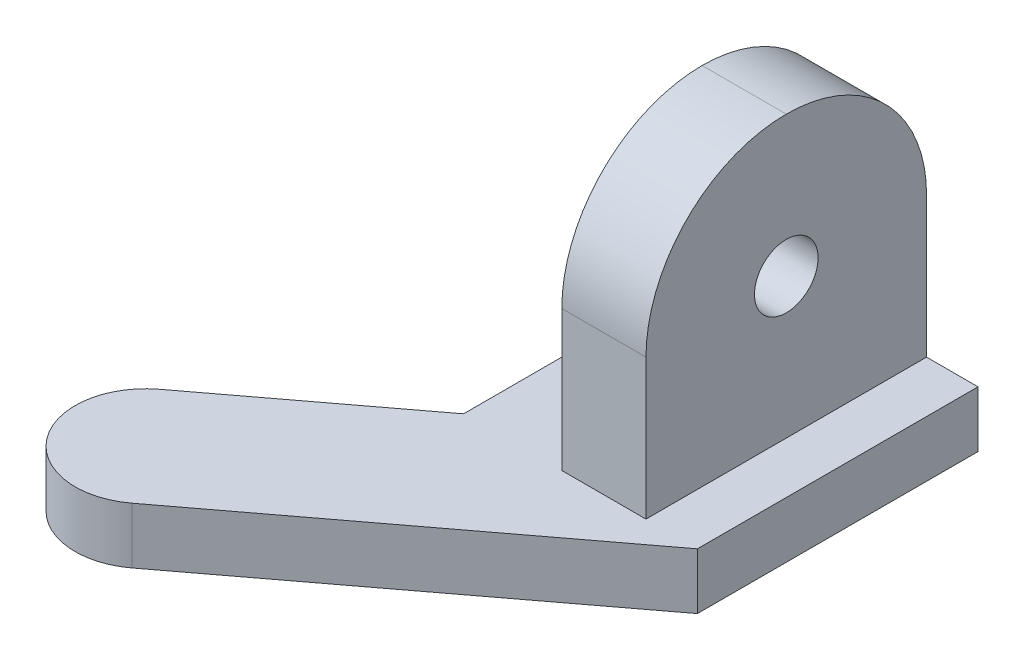
ISO-10303-21;
HEADER;
FILE_DESCRIPTION(('STEP AP214'),'2;1');
FILE_NAME('part.step','',(''),(''),'','','');
FILE_SCHEMA(('AUTOMOTIVE_DESIGN { 1 0 10303 214 1 1 1 1 }'));
ENDSEC;
DATA;
#1=APPLICATION_CONTEXT('core data for automotive mechanical design processes');
#2=APPLICATION_PROTOCOL_DEFINITION('international standard','automotive_design',2000,#1);
#3=PRODUCT_CONTEXT('',#1,'mechanical');
#4=PRODUCT('Part','Part','',(#3));
#5=PRODUCT_RELATED_PRODUCT_CATEGORY('part','',(#4));
#6=PRODUCT_DEFINITION_FORMATION('','',#4);
#7=PRODUCT_DEFINITION_CONTEXT('part definition',#1,'design');
#8=PRODUCT_DEFINITION('design','',#6,#7);
#9=PRODUCT_DEFINITION_SHAPE('','',#8);
#10=(LENGTH_UNIT() NAMED_UNIT(*) SI_UNIT(.MILLI.,.METRE.));
#11=(NAMED_UNIT(*) PLANE_ANGLE_UNIT() SI_UNIT($,.RADIAN.));
#12=(NAMED_UNIT(*) SI_UNIT($,.STERADIAN.) SOLID_ANGLE_UNIT());
#13=UNCERTAINTY_MEASURE_WITH_UNIT(LENGTH_MEASURE(1.E-05),#10,'distance_accuracy_value','');
#14=(GEOMETRIC_REPRESENTATION_CONTEXT(3) GLOBAL_UNCERTAINTY_ASSIGNED_CONTEXT((#13)) GLOBAL_UNIT_ASSIGNED_CONTEXT((#10,
#11,#12)) REPRESENTATION_CONTEXT('',''));
#15=CARTESIAN_POINT('',(0.,0.,0.));
#16=DIRECTION('',(0.,0.,1.));
#17=DIRECTION('',(1.,0.,0.));
#18=AXIS2_PLACEMENT_3D('',#15,#16,#17);
#19=CARTESIAN_POINT('',(6.25,3.,-7.5));
#20=DIRECTION('',(-1.,0.,0.));
#21=DIRECTION('',(0.,0.,1.));
#22=AXIS2_PLACEMENT_3D('',#19,#20,#21);
#23=PLANE('',#22);
#24=DIRECTION('',(0.,0.,-1.));
#25=VECTOR('',#24,1.);
#26=CARTESIAN_POINT('',(6.25,0.,-7.5));
#27=LINE('',#26,#25);
#28=CARTESIAN_POINT('',(6.25,0.,7.5));
#29=VERTEX_POINT('',#28);
#30=CARTESIAN_POINT('',(6.25,0.,-7.5));
#31=VERTEX_POINT('',#30);
#32=EDGE_CURVE('E195',#29,#31,#27,.T.);
#33=ORIENTED_EDGE('',*,*,#32,.T.);
#34=DIRECTION('',(0.,-1.,0.));
#35=VECTOR('',#34,1.);
#36=CARTESIAN_POINT('',(6.25,3.,-7.5));
#37=LINE('',#36,#35);
#38=CARTESIAN_POINT('',(6.25,3.,-7.5));
#39=VERTEX_POINT('',#38);
#40=EDGE_CURVE('E165',#39,#31,#37,.T.);
#41=ORIENTED_EDGE('',*,*,#40,.F.);
#42=DIRECTION('',(0.,0.,-1.));
#43=VECTOR('',#42,1.);
#44=CARTESIAN_POINT('',(6.25,3.,-7.5));
#45=LINE('',#44,#43);
#46=CARTESIAN_POINT('',(6.25,3.,7.5));
#47=VERTEX_POINT('',#46);
#48=EDGE_CURVE('E185',#47,#39,#45,.T.);
#49=ORIENTED_EDGE('',*,*,#48,.F.);
#50=DIRECTION('',(0.,-1.,0.));
#51=VECTOR('',#50,1.);
#52=CARTESIAN_POINT('',(6.25,3.,7.5));
#53=LINE('',#52,#51);
#54=EDGE_CURVE('E194',#47,#29,#53,.T.);
#55=ORIENTED_EDGE('',*,*,#54,.T.);
#56=EDGE_LOOP('',(#33,#41,#49,#55));
#57=FACE_BOUND('',#56,.T.);
#58=ADVANCED_FACE('F34',(#57),#23,.F.);
#59=CARTESIAN_POINT('',(-6.25,3.,-7.5));
#60=DIRECTION('',(0.,0.,1.));
#61=DIRECTION('',(1.,0.,0.));
#62=AXIS2_PLACEMENT_3D('',#59,#60,#61);
#63=PLANE('',#62);
#64=DIRECTION('',(0.,-1.,0.));
#65=VECTOR('',#64,1.);
#66=CARTESIAN_POINT('',(-1.,18.,-7.5));
#67=LINE('',#66,#65);
#68=CARTESIAN_POINT('',(-1.,10.5,-7.5));
#69=VERTEX_POINT('',#68);
#70=CARTESIAN_POINT('',(-0.999999999999999,3.,-7.5));
#71=VERTEX_POINT('',#70);
#72=EDGE_CURVE('E131',#69,#71,#67,.T.);
#73=ORIENTED_EDGE('',*,*,#72,.F.);
#74=DIRECTION('',(-1.,0.,0.));
#75=VECTOR('',#74,1.);
#76=CARTESIAN_POINT('',(3.5,10.5,-7.5));
#77=LINE('',#76,#75);
#78=CARTESIAN_POINT('',(3.5,10.5,-7.5));
#79=VERTEX_POINT('',#78);
#80=EDGE_CURVE('E155',#69,#79,#77,.F.);
#81=ORIENTED_EDGE('',*,*,#80,.T.);
#82=DIRECTION('',(0.,-1.,0.));
#83=VECTOR('',#82,1.);
#84=CARTESIAN_POINT('',(3.5,18.,-7.5));
#85=LINE('',#84,#83);
#86=CARTESIAN_POINT('',(3.5,3.,-7.5));
#87=VERTEX_POINT('',#86);
#88=EDGE_CURVE('E120',#79,#87,#85,.T.);
#89=ORIENTED_EDGE('',*,*,#88,.T.);
#90=DIRECTION('',(-1.,0.,0.));
#91=VECTOR('',#90,1.);
#92=CARTESIAN_POINT('',(-6.25,3.,-7.5));
#93=LINE('',#92,#91);
#94=EDGE_CURVE('E130',#39,#87,#93,.T.);
#95=ORIENTED_EDGE('',*,*,#94,.F.);
#96=ORIENTED_EDGE('',*,*,#40,.T.);
#97=DIRECTION('',(-1.,0.,0.));
#98=VECTOR('',#97,1.);
#99=CARTESIAN_POINT('',(-6.25,0.,-7.5));
#100=LINE('',#99,#98);
#101=CARTESIAN_POINT('',(-6.25,0.,-7.5));
#102=VERTEX_POINT('',#101);
#103=EDGE_CURVE('E197',#31,#102,#100,.T.);
#104=ORIENTED_EDGE('',*,*,#103,.T.);
#105=DIRECTION('',(0.,-1.,0.));
#106=VECTOR('',#105,1.);
#107=CARTESIAN_POINT('',(-6.25,3.,-7.5));
#108=LINE('',#107,#106);
#109=CARTESIAN_POINT('',(-6.25,3.,-7.5));
#110=VERTEX_POINT('',#109);
#111=EDGE_CURVE('E169',#110,#102,#108,.T.);
#112=ORIENTED_EDGE('',*,*,#111,.F.);
#113=EDGE_CURVE('E181',#71,#110,#93,.T.);
#114=ORIENTED_EDGE('',*,*,#113,.F.);
#115=EDGE_LOOP('',(#73,#81,#89,#95,#96,#104,#112,#114));
#116=FACE_BOUND('',#115,.T.);
#117=ADVANCED_FACE('F241',(#116),#63,.F.);
#118=CARTESIAN_POINT('',(-6.25,3.,7.5));
#119=DIRECTION('',(1.,0.,0.));
#120=DIRECTION('',(0.,0.,-1.));
#121=AXIS2_PLACEMENT_3D('',#118,#119,#120);
#122=PLANE('',#121);
#123=DIRECTION('',(0.,0.,1.));
#124=VECTOR('',#123,1.);
#125=CARTESIAN_POINT('',(-6.25,0.,7.5));
#126=LINE('',#125,#124);
#127=CARTESIAN_POINT('',(-6.25,0.,7.5));
#128=VERTEX_POINT('',#127);
#129=EDGE_CURVE('E199',#102,#128,#126,.T.);
#130=ORIENTED_EDGE('',*,*,#129,.T.);
#131=DIRECTION('',(0.,-1.,0.));
#132=VECTOR('',#131,1.);
#133=CARTESIAN_POINT('',(-6.25,3.,7.5));
#134=LINE('',#133,#132);
#135=CARTESIAN_POINT('',(-6.25,3.,7.5));
#136=VERTEX_POINT('',#135);
#137=EDGE_CURVE('E174',#136,#128,#134,.T.);
#138=ORIENTED_EDGE('',*,*,#137,.F.);
#139=DIRECTION('',(0.,0.,1.));
#140=VECTOR('',#139,1.);
#141=CARTESIAN_POINT('',(-6.25,3.,7.5));
#142=LINE('',#141,#140);
#143=EDGE_CURVE('E180',#110,#136,#142,.T.);
#144=ORIENTED_EDGE('',*,*,#143,.F.);
#145=ORIENTED_EDGE('',*,*,#111,.T.);
#146=EDGE_LOOP('',(#130,#138,#144,#145));
#147=FACE_BOUND('',#146,.T.);
#148=ADVANCED_FACE('F240',(#147),#122,.F.);
#149=CARTESIAN_POINT('',(-6.25,3.,7.5));
#150=DIRECTION('',(0.602406905911872,0.,0.798189150333231));
#151=DIRECTION('',(0.798189150333231,0.,-0.602406905911872));
#152=AXIS2_PLACEMENT_3D('',#149,#150,#151);
#153=PLANE('',#152);
#154=DIRECTION('',(-0.798189150333231,0.,0.602406905911872));
#155=VECTOR('',#154,1.);
#156=CARTESIAN_POINT('',(-6.25,0.,7.5));
#157=LINE('',#156,#155);
#158=CARTESIAN_POINT('',(-15.5180880018145,0.,14.4947833975958));
#159=VERTEX_POINT('',#158);
#160=EDGE_CURVE('E201',#128,#159,#157,.T.);
#161=ORIENTED_EDGE('',*,*,#160,.T.);
#162=DIRECTION('',(0.,-1.,0.));
#163=VECTOR('',#162,1.);
#164=CARTESIAN_POINT('',(-15.5180880018145,3.,14.4947833975958));
#165=LINE('',#164,#163);
#166=CARTESIAN_POINT('',(-15.5180880018145,3.,14.4947833975958));
#167=VERTEX_POINT('',#166);
#168=EDGE_CURVE('E212',#167,#159,#165,.T.);
#169=ORIENTED_EDGE('',*,*,#168,.F.);
#170=DIRECTION('',(-0.798189150333231,0.,0.602406905911872));
#171=VECTOR('',#170,1.);
#172=CARTESIAN_POINT('',(-6.25,3.,7.5));
#173=LINE('',#172,#171);
#174=EDGE_CURVE('E188',#136,#167,#173,.T.);
#175=ORIENTED_EDGE('',*,*,#174,.F.);
#176=ORIENTED_EDGE('',*,*,#137,.T.);
#177=EDGE_LOOP('',(#161,#169,#175,#176));
#178=FACE_BOUND('',#177,.T.);
#179=ADVANCED_FACE('F219',(#178),#153,.F.);
#180=CARTESIAN_POINT('',(-13.25,3.,17.5));
#181=DIRECTION('',(0.,-1.,0.));
#182=DIRECTION('',(0.,0.,-1.));
#183=AXIS2_PLACEMENT_3D('',#180,#181,#182);
#184=CYLINDRICAL_SURFACE('',#183,3.7650431619492);
#185=CARTESIAN_POINT('',(-13.25,0.,17.5));
#186=DIRECTION('',(0.,1.,0.));
#187=DIRECTION('',(0.,0.,1.));
#188=AXIS2_PLACEMENT_3D('',#185,#186,#187);
#189=CIRCLE('',#188,3.7650431619492);
#190=CARTESIAN_POINT('',(-10.9819119981855,0.,20.5052166024042));
#191=VERTEX_POINT('',#190);
#192=EDGE_CURVE('E203',#159,#191,#189,.T.);
#193=ORIENTED_EDGE('',*,*,#192,.T.);
#194=DIRECTION('',(0.,-1.,0.));
#195=VECTOR('',#194,1.);
#196=CARTESIAN_POINT('',(-10.9819119981855,3.,20.5052166024042));
#197=LINE('',#196,#195);
#198=CARTESIAN_POINT('',(-10.9819119981855,3.,20.5052166024042));
#199=VERTEX_POINT('',#198);
#200=EDGE_CURVE('E209',#199,#191,#197,.T.);
#201=ORIENTED_EDGE('',*,*,#200,.F.);
#202=CARTESIAN_POINT('',(-13.25,3.,17.5));
#203=DIRECTION('',(0.,1.,0.));
#204=DIRECTION('',(0.,0.,1.));
#205=AXIS2_PLACEMENT_3D('',#202,#203,#204);
#206=CIRCLE('',#205,3.7650431619492);
#207=EDGE_CURVE('E190',#167,#199,#206,.T.);
#208=ORIENTED_EDGE('',*,*,#207,.F.);
#209=ORIENTED_EDGE('',*,*,#168,.T.);
#210=EDGE_LOOP('',(#193,#201,#208,#209));
#211=FACE_BOUND('',#210,.T.);
#212=ADVANCED_FACE('F231',(#211),#184,.T.);
#213=CARTESIAN_POINT('',(6.25,3.,7.5));
#214=DIRECTION('',(-0.602406905911872,0.,-0.798189150333231));
#215=DIRECTION('',(-0.798189150333231,0.,0.602406905911872));
#216=AXIS2_PLACEMENT_3D('',#213,#214,#215);
#217=PLANE('',#216);
#218=DIRECTION('',(0.798189150333231,0.,-0.602406905911872));
#219=VECTOR('',#218,1.);
#220=CARTESIAN_POINT('',(6.25,0.,7.5));
#221=LINE('',#220,#219);
#222=EDGE_CURVE('E205',#191,#29,#221,.T.);
#223=ORIENTED_EDGE('',*,*,#222,.T.);
#224=ORIENTED_EDGE('',*,*,#54,.F.);
#225=DIRECTION('',(0.798189150333231,0.,-0.602406905911872));
#226=VECTOR('',#225,1.);
#227=CARTESIAN_POINT('',(6.25,3.,7.5));
#228=LINE('',#227,#226);
#229=EDGE_CURVE('E192',#199,#47,#228,.T.);
#230=ORIENTED_EDGE('',*,*,#229,.F.);
#231=ORIENTED_EDGE('',*,*,#200,.T.);
#232=EDGE_LOOP('',(#223,#224,#230,#231));
#233=FACE_BOUND('',#232,.T.);
#234=ADVANCED_FACE('F235',(#233),#217,.F.);
#235=CARTESIAN_POINT('',(-13.25,3.,17.5));
#236=DIRECTION('',(0.,1.,0.));
#237=DIRECTION('',(0.,0.,1.));
#238=AXIS2_PLACEMENT_3D('',#235,#236,#237);
#239=PLANE('',#238);
#240=DIRECTION('',(0.,0.,1.));
#241=VECTOR('',#240,1.);
#242=CARTESIAN_POINT('',(-1.,3.,-7.5));
#243=LINE('',#242,#241);
#244=CARTESIAN_POINT('',(-0.999999999999998,3.,7.5));
#245=VERTEX_POINT('',#244);
#246=EDGE_CURVE('E135',#71,#245,#243,.T.);
#247=ORIENTED_EDGE('',*,*,#246,.F.);
#248=ORIENTED_EDGE('',*,*,#113,.T.);
#249=ORIENTED_EDGE('',*,*,#143,.T.);
#250=ORIENTED_EDGE('',*,*,#174,.T.);
#251=ORIENTED_EDGE('',*,*,#207,.T.);
#252=ORIENTED_EDGE('',*,*,#229,.T.);
#253=ORIENTED_EDGE('',*,*,#48,.T.);
#254=ORIENTED_EDGE('',*,*,#94,.T.);
#255=DIRECTION('',(0.,0.,-1.));
#256=VECTOR('',#255,1.);
#257=CARTESIAN_POINT('',(3.5,3.,-7.5));
#258=LINE('',#257,#256);
#259=CARTESIAN_POINT('',(3.5,3.,7.5));
#260=VERTEX_POINT('',#259);
#261=EDGE_CURVE('E115',#260,#87,#258,.T.);
#262=ORIENTED_EDGE('',*,*,#261,.F.);
#263=DIRECTION('',(1.,0.,0.));
#264=VECTOR('',#263,1.);
#265=CARTESIAN_POINT('',(-0.999999999999998,3.,7.5));
#266=LINE('',#265,#264);
#267=EDGE_CURVE('E127',#245,#260,#266,.T.);
#268=ORIENTED_EDGE('',*,*,#267,.F.);
#269=EDGE_LOOP('',(#247,#248,#249,#250,#251,#252,#253,#254,#262,#268));
#270=FACE_BOUND('',#269,.T.);
#271=ADVANCED_FACE('F126',(#270),#239,.T.);
#272=CARTESIAN_POINT('',(-13.25,0.,17.5));
#273=DIRECTION('',(0.,1.,0.));
#274=DIRECTION('',(0.,0.,1.));
#275=AXIS2_PLACEMENT_3D('',#272,#273,#274);
#276=PLANE('',#275);
#277=ORIENTED_EDGE('',*,*,#32,.F.);
#278=ORIENTED_EDGE('',*,*,#222,.F.);
#279=ORIENTED_EDGE('',*,*,#192,.F.);
#280=ORIENTED_EDGE('',*,*,#160,.F.);
#281=ORIENTED_EDGE('',*,*,#129,.F.);
#282=ORIENTED_EDGE('',*,*,#103,.F.);
#283=EDGE_LOOP('',(#277,#278,#279,#280,#281,#282));
#284=FACE_BOUND('',#283,.T.);
#285=ADVANCED_FACE('F227',(#284),#276,.F.);
#286=CARTESIAN_POINT('',(-1.,18.,-7.5));
#287=DIRECTION('',(1.,0.,0.));
#288=DIRECTION('',(0.,0.,-1.));
#289=AXIS2_PLACEMENT_3D('',#286,#287,#288);
#290=PLANE('',#289);
#291=CARTESIAN_POINT('',(-1.,10.5,0.));
#292=DIRECTION('',(1.,0.,0.));
#293=DIRECTION('',(0.,0.,-1.));
#294=AXIS2_PLACEMENT_3D('',#291,#292,#293);
#295=CIRCLE('',#294,1.7);
#296=CARTESIAN_POINT('',(-1.,10.5,-1.7));
#297=VERTEX_POINT('',#296);
#298=EDGE_CURVE('E137',#297,#297,#295,.F.);
#299=ORIENTED_EDGE('',*,*,#298,.F.);
#300=EDGE_LOOP('',(#299));
#301=FACE_BOUND('',#300,.T.);
#302=CARTESIAN_POINT('',(-0.999999999999999,10.5,0.));
#303=DIRECTION('',(1.,0.,0.));
#304=DIRECTION('',(0.,0.,-1.));
#305=AXIS2_PLACEMENT_3D('',#302,#303,#304);
#306=CIRCLE('',#305,7.5);
#307=CARTESIAN_POINT('',(-0.999999999999998,10.5,7.5));
#308=VERTEX_POINT('',#307);
#309=CARTESIAN_POINT('',(-0.999999999999999,18.,0.));
#310=VERTEX_POINT('',#309);
#311=EDGE_CURVE('E162',#308,#310,#306,.F.);
#312=ORIENTED_EDGE('',*,*,#311,.T.);
#313=CARTESIAN_POINT('',(-0.999999999999999,10.5,0.));
#314=DIRECTION('',(1.,0.,0.));
#315=DIRECTION('',(0.,0.,-1.));
#316=AXIS2_PLACEMENT_3D('',#313,#314,#315);
#317=CIRCLE('',#316,7.5);
#318=EDGE_CURVE('E154',#310,#69,#317,.F.);
#319=ORIENTED_EDGE('',*,*,#318,.T.);
#320=ORIENTED_EDGE('',*,*,#72,.T.);
#321=ORIENTED_EDGE('',*,*,#246,.T.);
#322=DIRECTION('',(0.,-1.,0.));
#323=VECTOR('',#322,1.);
#324=CARTESIAN_POINT('',(-0.999999999999998,18.,7.5));
#325=LINE('',#324,#323);
#326=EDGE_CURVE('E119',#308,#245,#325,.T.);
#327=ORIENTED_EDGE('',*,*,#326,.F.);
#328=EDGE_LOOP('',(#312,#319,#320,#321,#327));
#329=FACE_BOUND('',#328,.T.);
#330=ADVANCED_FACE('F267',(#301,#329),#290,.F.);
#331=CARTESIAN_POINT('',(-0.999999999999998,18.,7.5));
#332=DIRECTION('',(0.,0.,-1.));
#333=DIRECTION('',(-1.,0.,0.));
#334=AXIS2_PLACEMENT_3D('',#331,#332,#333);
#335=PLANE('',#334);
#336=DIRECTION('',(0.,-1.,0.));
#337=VECTOR('',#336,1.);
#338=CARTESIAN_POINT('',(3.5,18.,7.5));
#339=LINE('',#338,#337);
#340=CARTESIAN_POINT('',(3.5,10.5,7.5));
#341=VERTEX_POINT('',#340);
#342=EDGE_CURVE('E112',#341,#260,#339,.T.);
#343=ORIENTED_EDGE('',*,*,#342,.F.);
#344=DIRECTION('',(1.,0.,0.));
#345=VECTOR('',#344,1.);
#346=CARTESIAN_POINT('',(-0.999999999999998,10.5,7.5));
#347=LINE('',#346,#345);
#348=EDGE_CURVE('E11',#341,#308,#347,.F.);
#349=ORIENTED_EDGE('',*,*,#348,.T.);
#350=ORIENTED_EDGE('',*,*,#326,.T.);
#351=ORIENTED_EDGE('',*,*,#267,.T.);
#352=EDGE_LOOP('',(#343,#349,#350,#351));
#353=FACE_BOUND('',#352,.T.);
#354=ADVANCED_FACE('F133',(#353),#335,.F.);
#355=CARTESIAN_POINT('',(3.5,18.,-7.5));
#356=DIRECTION('',(-1.,0.,0.));
#357=DIRECTION('',(0.,0.,1.));
#358=AXIS2_PLACEMENT_3D('',#355,#356,#357);
#359=PLANE('',#358);
#360=CARTESIAN_POINT('',(3.5,10.5,0.));
#361=DIRECTION('',(1.,0.,0.));
#362=DIRECTION('',(0.,0.,-1.));
#363=AXIS2_PLACEMENT_3D('',#360,#361,#362);
#364=CIRCLE('',#363,1.7);
#365=CARTESIAN_POINT('',(3.5,10.5,-1.7));
#366=VERTEX_POINT('',#365);
#367=EDGE_CURVE('E259',#366,#366,#364,.T.);
#368=ORIENTED_EDGE('',*,*,#367,.F.);
#369=EDGE_LOOP('',(#368));
#370=FACE_BOUND('',#369,.T.);
#371=ORIENTED_EDGE('',*,*,#88,.F.);
#372=CARTESIAN_POINT('',(3.5,10.5,0.));
#373=DIRECTION('',(-1.,0.,0.));
#374=DIRECTION('',(0.,0.,1.));
#375=AXIS2_PLACEMENT_3D('',#372,#373,#374);
#376=CIRCLE('',#375,7.5);
#377=CARTESIAN_POINT('',(3.5,18.,0.));
#378=VERTEX_POINT('',#377);
#379=EDGE_CURVE('E43',#79,#378,#376,.F.);
#380=ORIENTED_EDGE('',*,*,#379,.T.);
#381=CARTESIAN_POINT('',(3.5,10.5,0.));
#382=DIRECTION('',(-1.,0.,0.));
#383=DIRECTION('',(0.,0.,1.));
#384=AXIS2_PLACEMENT_3D('',#381,#382,#383);
#385=CIRCLE('',#384,7.5);
#386=EDGE_CURVE('E50',#378,#341,#385,.F.);
#387=ORIENTED_EDGE('',*,*,#386,.T.);
#388=ORIENTED_EDGE('',*,*,#342,.T.);
#389=ORIENTED_EDGE('',*,*,#261,.T.);
#390=EDGE_LOOP('',(#371,#380,#387,#388,#389));
#391=FACE_BOUND('',#390,.T.);
#392=ADVANCED_FACE('F114',(#370,#391),#359,.F.);
#393=CARTESIAN_POINT('',(-17.0160431619492,10.5,0.));
#394=DIRECTION('',(1.,0.,0.));
#395=DIRECTION('',(0.,0.,-1.));
#396=AXIS2_PLACEMENT_3D('',#393,#394,#395);
#397=CYLINDRICAL_SURFACE('',#396,1.7);
#398=ORIENTED_EDGE('',*,*,#367,.T.);
#399=EDGE_LOOP('',(#398));
#400=FACE_BOUND('',#399,.T.);
#401=ORIENTED_EDGE('',*,*,#298,.T.);
#402=EDGE_LOOP('',(#401));
#403=FACE_BOUND('',#402,.T.);
#404=ADVANCED_FACE('F256',(#400,#403),#397,.F.);
#405=CARTESIAN_POINT('',(0.,10.5,0.));
#406=DIRECTION('',(-1.,0.,0.));
#407=DIRECTION('',(0.,0.,1.));
#408=AXIS2_PLACEMENT_3D('',#405,#406,#407);
#409=CYLINDRICAL_SURFACE('',#408,7.5);
#410=ORIENTED_EDGE('',*,*,#348,.F.);
#411=ORIENTED_EDGE('',*,*,#386,.F.);
#412=DIRECTION('',(1.,0.,0.));
#413=VECTOR('',#412,1.);
#414=CARTESIAN_POINT('',(3.5,18.,0.));
#415=LINE('',#414,#413);
#416=EDGE_CURVE('E38',#310,#378,#415,.T.);
#417=ORIENTED_EDGE('',*,*,#416,.F.);
#418=ORIENTED_EDGE('',*,*,#311,.F.);
#419=EDGE_LOOP('',(#410,#411,#417,#418));
#420=FACE_BOUND('',#419,.T.);
#421=ADVANCED_FACE('F36',(#420),#409,.T.);
#422=CARTESIAN_POINT('',(0.,10.5,0.));
#423=DIRECTION('',(1.,0.,0.));
#424=DIRECTION('',(0.,0.,-1.));
#425=AXIS2_PLACEMENT_3D('',#422,#423,#424);
#426=CYLINDRICAL_SURFACE('',#425,7.5);
#427=ORIENTED_EDGE('',*,*,#379,.F.);
#428=ORIENTED_EDGE('',*,*,#80,.F.);
#429=ORIENTED_EDGE('',*,*,#318,.F.);
#430=ORIENTED_EDGE('',*,*,#416,.T.);
#431=EDGE_LOOP('',(#427,#428,#429,#430));
#432=FACE_BOUND('',#431,.T.);
#433=ADVANCED_FACE('F250',(#432),#426,.T.);
#434=CLOSED_SHELL('',(#58,#117,#148,#179,#212,#234,#271,#285,#330,#354,#392,#404,#421,#433));
#435=MANIFOLD_SOLID_BREP('B2',#434);
#436=ADVANCED_BREP_SHAPE_REPRESENTATION('',(#18,#435),#14);
#437=SHAPE_DEFINITION_REPRESENTATION(#9,#436);
ENDSEC;
END-ISO-10303-21;
